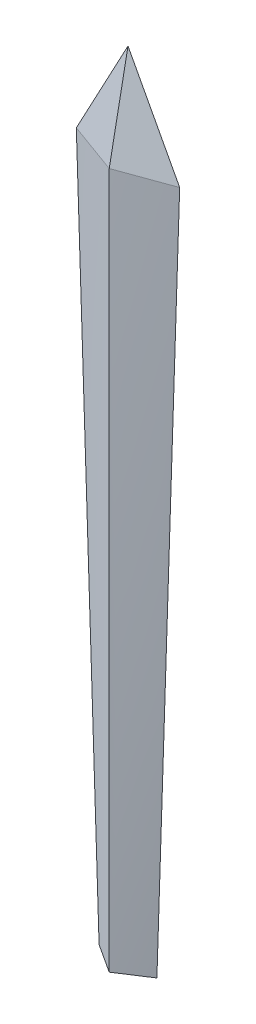
ISO-10303-21;
HEADER;
FILE_DESCRIPTION(('STEP AP214'),'2;1');
FILE_NAME('part.step','',(''),(''),'','','');
FILE_SCHEMA(('AUTOMOTIVE_DESIGN { 1 0 10303 214 1 1 1 1 }'));
ENDSEC;
DATA;
#1=APPLICATION_CONTEXT('core data for automotive mechanical design processes');
#2=APPLICATION_PROTOCOL_DEFINITION('international standard','automotive_design',2000,#1);
#3=PRODUCT_CONTEXT('',#1,'mechanical');
#4=PRODUCT('Part','Part','',(#3));
#5=PRODUCT_RELATED_PRODUCT_CATEGORY('part','',(#4));
#6=PRODUCT_DEFINITION_FORMATION('','',#4);
#7=PRODUCT_DEFINITION_CONTEXT('part definition',#1,'design');
#8=PRODUCT_DEFINITION('design','',#6,#7);
#9=PRODUCT_DEFINITION_SHAPE('','',#8);
#10=(LENGTH_UNIT() NAMED_UNIT(*) SI_UNIT(.MILLI.,.METRE.));
#11=(NAMED_UNIT(*) PLANE_ANGLE_UNIT() SI_UNIT($,.RADIAN.));
#12=(NAMED_UNIT(*) SI_UNIT($,.STERADIAN.) SOLID_ANGLE_UNIT());
#13=UNCERTAINTY_MEASURE_WITH_UNIT(LENGTH_MEASURE(1.E-05),#10,'distance_accuracy_value','');
#14=(GEOMETRIC_REPRESENTATION_CONTEXT(3) GLOBAL_UNCERTAINTY_ASSIGNED_CONTEXT((#13)) GLOBAL_UNIT_ASSIGNED_CONTEXT((#10,
#11,#12)) REPRESENTATION_CONTEXT('',''));
#15=CARTESIAN_POINT('',(0.,0.,0.));
#16=DIRECTION('',(0.,0.,1.));
#17=DIRECTION('',(1.,0.,0.));
#18=AXIS2_PLACEMENT_3D('',#15,#16,#17);
#19=CARTESIAN_POINT('',(83.1598258990977,161.257710748184,-19.05));
#20=DIRECTION('',(0.,-1.,0.));
#21=DIRECTION('',(0.,0.,-1.));
#22=AXIS2_PLACEMENT_3D('',#19,#20,#21);
#23=PLANE('',#22);
#24=CARTESIAN_POINT('',(112.49357951859,161.257710748184,0.));
#25=DIRECTION('',(0.,-1.,0.));
#26=DIRECTION('',(0.,0.,-1.));
#27=AXIS2_PLACEMENT_3D('',#24,#25,#26);
#28=CIRCLE('',#27,4.7625);
#29=CARTESIAN_POINT('',(112.49357951859,161.257710748184,-4.7625));
#30=VERTEX_POINT('',#29);
#31=EDGE_CURVE('E468',#30,#30,#28,.T.);
#32=ORIENTED_EDGE('',*,*,#31,.F.);
#33=EDGE_LOOP('',(#32));
#34=FACE_BOUND('',#33,.T.);
#35=DIRECTION('',(0.838664852319049,0.,0.544647836206726));
#36=VECTOR('',#35,1.);
#37=CARTESIAN_POINT('',(112.49357951859,161.257710748184,-19.05));
#38=LINE('',#37,#36);
#39=CARTESIAN_POINT('',(112.49357951859,161.257710748184,-19.05));
#40=VERTEX_POINT('',#39);
#41=CARTESIAN_POINT('',(141.827333138083,161.257710748184,0.));
#42=VERTEX_POINT('',#41);
#43=EDGE_CURVE('E283',#40,#42,#38,.T.);
#44=ORIENTED_EDGE('',*,*,#43,.T.);
#45=DIRECTION('',(0.838664852319049,0.,-0.544647836206726));
#46=VECTOR('',#45,1.);
#47=CARTESIAN_POINT('',(112.49357951859,161.257710748184,19.05));
#48=LINE('',#47,#46);
#49=CARTESIAN_POINT('',(112.49357951859,161.257710748184,19.05));
#50=VERTEX_POINT('',#49);
#51=EDGE_CURVE('E452',#50,#42,#48,.T.);
#52=ORIENTED_EDGE('',*,*,#51,.F.);
#53=DIRECTION('',(0.838664852319049,0.,0.544647836206726));
#54=VECTOR('',#53,1.);
#55=CARTESIAN_POINT('',(83.1598258990977,161.257710748184,0.));
#56=LINE('',#55,#54);
#57=CARTESIAN_POINT('',(83.1598258990977,161.257710748184,0.));
#58=VERTEX_POINT('',#57);
#59=EDGE_CURVE('E378',#58,#50,#56,.T.);
#60=ORIENTED_EDGE('',*,*,#59,.F.);
#61=DIRECTION('',(0.838664852319049,0.,-0.544647836206726));
#62=VECTOR('',#61,1.);
#63=CARTESIAN_POINT('',(83.1598258990977,161.257710748184,0.));
#64=LINE('',#63,#62);
#65=EDGE_CURVE('E235',#58,#40,#64,.T.);
#66=ORIENTED_EDGE('',*,*,#65,.T.);
#67=EDGE_LOOP('',(#44,#52,#60,#66));
#68=FACE_BOUND('',#67,.T.);
#69=ADVANCED_FACE('F217',(#34,#68),#23,.T.);
#70=CARTESIAN_POINT('',(141.827333138083,161.257710748184,0.));
#71=CARTESIAN_POINT('',(149.526305827459,396.68402157142,0.));
#72=CARTESIAN_POINT('',(157.225278516836,632.110332394656,0.));
#73=CARTESIAN_POINT('',(164.924251206212,867.536643217892,0.));
#74=CARTESIAN_POINT('',(139.382853669792,161.257710748184,1.58749999999999));
#75=CARTESIAN_POINT('',(146.44024530172,396.68402157142,1.58749999999999));
#76=CARTESIAN_POINT('',(153.497636933649,632.110332394656,1.58749999999999));
#77=CARTESIAN_POINT('',(160.555028565577,867.536643217892,1.58749999999999));
#78=CARTESIAN_POINT('',(134.49389473321,161.257710748184,4.76249999999998));
#79=CARTESIAN_POINT('',(140.268124250242,396.68402157142,4.76249999999998));
#80=CARTESIAN_POINT('',(146.042353767274,632.110332394655,4.76249999999998));
#81=CARTESIAN_POINT('',(151.816583284307,867.536643217891,4.76249999999998));
#82=CARTESIAN_POINT('',(127.160456328337,161.257710748184,9.52500000000001));
#83=CARTESIAN_POINT('',(131.009942673025,396.68402157142,9.52500000000001));
#84=CARTESIAN_POINT('',(134.859429017713,632.110332394657,9.52500000000001));
#85=CARTESIAN_POINT('',(138.708915362401,867.536643217893,9.52500000000001));
#86=CARTESIAN_POINT('',(119.827017923463,161.257710748184,14.2875));
#87=CARTESIAN_POINT('',(121.751761095808,396.68402157142,14.2875));
#88=CARTESIAN_POINT('',(123.676504268152,632.110332394655,14.2875));
#89=CARTESIAN_POINT('',(125.601247440496,867.536643217891,14.2875));
#90=CARTESIAN_POINT('',(114.938058986881,161.257710748184,17.4625));
#91=CARTESIAN_POINT('',(115.579640044329,396.68402157142,17.4625));
#92=CARTESIAN_POINT('',(116.221221101777,632.110332394656,17.4625));
#93=CARTESIAN_POINT('',(116.862802159226,867.536643217892,17.4625));
#94=CARTESIAN_POINT('',(112.49357951859,161.257710748184,19.05));
#95=CARTESIAN_POINT('',(112.49357951859,396.68402157142,19.05));
#96=CARTESIAN_POINT('',(112.49357951859,632.110332394656,19.05));
#97=CARTESIAN_POINT('',(112.49357951859,867.536643217892,19.05));
#98=B_SPLINE_SURFACE_WITH_KNOTS('',3,3,((#70,#71,#72,#73),(#74,#75,#76,#77),(#78,#79,#80,#81),
(#82,#83,#84,#85),(#86,#87,#88,#89),(#90,#91,#92,#93),(#94,#95,#96,#97)),.UNSPECIFIED.,.F.,.F.,
.F.,(4,1,1,1,4),(4,4),(0.861351910749801,0.89601393306235,0.9306759553749,0.96533797768745,1.),
(0.,1.),.UNSPECIFIED.);
#99=CARTESIAN_POINT('',(141.827333138083,161.257710748184,0.));
#100=CARTESIAN_POINT('',(149.526305827459,396.68402157142,0.));
#101=CARTESIAN_POINT('',(157.225278516836,632.110332394656,0.));
#102=CARTESIAN_POINT('',(164.924251206212,867.536643217892,0.));
#103=B_SPLINE_CURVE_WITH_KNOTS('',3,(#99,#100,#101,#102),.UNSPECIFIED.,.F.,.F.,(4,4),(0.,1.),.UNSPECIFIED.);
#104=CARTESIAN_POINT('',(164.924251206212,867.536643217892,0.));
#105=VERTEX_POINT('',#104);
#106=EDGE_CURVE('E366',#42,#105,#103,.T.);
#107=DIRECTION('',(-0.939883773707444,0.,0.341494497644477));
#108=VECTOR('',#107,1.);
#109=CARTESIAN_POINT('',(112.49357951859,867.536643217892,19.05));
#110=LINE('',#109,#108);
#111=CARTESIAN_POINT('',(112.49357951859,867.536643217892,19.05));
#112=VERTEX_POINT('',#111);
#113=EDGE_CURVE('E353',#105,#112,#110,.T.);
#114=CARTESIAN_POINT('',(112.49357951859,161.257710748184,19.05));
#115=CARTESIAN_POINT('',(112.49357951859,396.68402157142,19.05));
#116=CARTESIAN_POINT('',(112.49357951859,632.110332394656,19.05));
#117=CARTESIAN_POINT('',(112.49357951859,867.536643217892,19.05));
#118=B_SPLINE_CURVE_WITH_KNOTS('',3,(#114,#115,#116,#117),.UNSPECIFIED.,.F.,.F.,(4,4),(0.,1.),.UNSPECIFIED.);
#119=EDGE_CURVE('E368',#50,#112,#118,.T.);
#120=ORIENTED_EDGE('',*,*,#51,.T.);
#121=ORIENTED_EDGE('',*,*,#106,.T.);
#122=ORIENTED_EDGE('',*,*,#113,.T.);
#123=ORIENTED_EDGE('',*,*,#119,.F.);
#124=EDGE_LOOP('',(#120,#121,#122,#123));
#125=FACE_BOUND('',#124,.T.);
#126=ADVANCED_FACE('F401',(#125),#98,.F.);
#127=CARTESIAN_POINT('',(112.49357951859,161.257710748184,19.05));
#128=CARTESIAN_POINT('',(112.49357951859,396.68402157142,19.05));
#129=CARTESIAN_POINT('',(112.49357951859,632.110332394656,19.05));
#130=CARTESIAN_POINT('',(112.49357951859,867.536643217892,19.05));
#131=CARTESIAN_POINT('',(110.049100050299,161.257710748184,17.4625));
#132=CARTESIAN_POINT('',(109.407518992851,396.68402157142,17.4625));
#133=CARTESIAN_POINT('',(108.765937935403,632.110332394656,17.4625));
#134=CARTESIAN_POINT('',(108.124356877955,867.536643217892,17.4625));
#135=CARTESIAN_POINT('',(105.160141113717,161.257710748184,14.2875));
#136=CARTESIAN_POINT('',(103.235397941373,396.68402157142,14.2875));
#137=CARTESIAN_POINT('',(101.310654769029,632.110332394657,14.2875));
#138=CARTESIAN_POINT('',(99.3859115966851,867.536643217893,14.2875));
#139=CARTESIAN_POINT('',(97.826702708844,161.257710748184,9.52500000000001));
#140=CARTESIAN_POINT('',(93.9772163641559,396.68402157142,9.52500000000002));
#141=CARTESIAN_POINT('',(90.1277300194678,632.110332394655,9.52500000000002));
#142=CARTESIAN_POINT('',(86.2782436747797,867.536643217891,9.52500000000002));
#143=CARTESIAN_POINT('',(90.4932643039709,161.257710748184,4.76249999999999));
#144=CARTESIAN_POINT('',(84.7190347869387,396.68402157142,4.76249999999998));
#145=CARTESIAN_POINT('',(78.9448052699065,632.110332394656,4.76249999999998));
#146=CARTESIAN_POINT('',(73.1705757528742,867.536643217892,4.76249999999998));
#147=CARTESIAN_POINT('',(85.6043053673888,161.257710748184,1.58749999999999));
#148=CARTESIAN_POINT('',(78.5469137354605,396.68402157142,1.58749999999999));
#149=CARTESIAN_POINT('',(71.4895221035323,632.110332394656,1.58749999999999));
#150=CARTESIAN_POINT('',(64.432130471604,867.536643217892,1.58749999999999));
#151=CARTESIAN_POINT('',(83.1598258990977,161.257710748184,0.));
#152=CARTESIAN_POINT('',(75.4608532097214,396.68402157142,0.));
#153=CARTESIAN_POINT('',(67.7618805203452,632.110332394656,0.));
#154=CARTESIAN_POINT('',(60.0629078309689,867.536643217892,0.));
#155=B_SPLINE_SURFACE_WITH_KNOTS('',3,3,((#127,#128,#129,#130),(#131,#132,#133,#134),(#135,#136,
#137,#138),(#139,#140,#141,#142),(#143,#144,#145,#146),(#147,#148,#149,#150),(#151,#152,#153,
#154)),.UNSPECIFIED.,.F.,.F.,.F.,(4,1,1,1,4),(4,4),(0.,0.0346620223125498,0.0693240446250997,
0.103986066937649,0.138648089250199),(0.,1.),.UNSPECIFIED.);
#156=DIRECTION('',(-0.939883773707444,0.,-0.341494497644477));
#157=VECTOR('',#156,1.);
#158=CARTESIAN_POINT('',(60.0629078309689,867.536643217892,0.));
#159=LINE('',#158,#157);
#160=CARTESIAN_POINT('',(60.0629078309689,867.536643217891,0.));
#161=VERTEX_POINT('',#160);
#162=EDGE_CURVE('E220',#112,#161,#159,.T.);
#163=CARTESIAN_POINT('',(83.1598258990977,161.257710748184,0.));
#164=CARTESIAN_POINT('',(75.4608532097214,396.68402157142,0.));
#165=CARTESIAN_POINT('',(67.7618805203452,632.110332394656,0.));
#166=CARTESIAN_POINT('',(60.0629078309689,867.536643217892,0.));
#167=B_SPLINE_CURVE_WITH_KNOTS('',3,(#163,#164,#165,#166),.UNSPECIFIED.,.F.,.F.,(4,4),(0.,1.),.UNSPECIFIED.);
#168=EDGE_CURVE('E287',#58,#161,#167,.T.);
#169=ORIENTED_EDGE('',*,*,#59,.T.);
#170=ORIENTED_EDGE('',*,*,#119,.T.);
#171=ORIENTED_EDGE('',*,*,#162,.T.);
#172=ORIENTED_EDGE('',*,*,#168,.F.);
#173=EDGE_LOOP('',(#169,#170,#171,#172));
#174=FACE_BOUND('',#173,.T.);
#175=ADVANCED_FACE('F411',(#174),#155,.F.);
#176=CARTESIAN_POINT('',(70.9371523987199,37.9094009639735,195.237929022155));
#177=DIRECTION('',(-0.335945923324431,-0.179532280037618,-0.924612619979952));
#178=DIRECTION('',(-0.939883773707444,0.,0.341494497644477));
#179=AXIS2_PLACEMENT_3D('',#176,#177,#178);
#180=PLANE('',#179);
#181=DIRECTION('',(0.471326172585912,-0.88195897809111,0.));
#182=VECTOR('',#181,1.);
#183=CARTESIAN_POINT('',(112.49357951859,965.646411594517,0.));
#184=LINE('',#183,#182);
#185=CARTESIAN_POINT('',(112.49357951859,965.646411594518,0.));
#186=VERTEX_POINT('',#185);
#187=EDGE_CURVE('E272',#186,#105,#184,.T.);
#188=ORIENTED_EDGE('',*,*,#187,.F.);
#189=DIRECTION('',(0.,-0.981665783480344,0.190610308073625));
#190=VECTOR('',#189,1.);
#191=CARTESIAN_POINT('',(112.493579518591,35.0841450231016,180.687524509629));
#192=LINE('',#191,#190);
#193=EDGE_CURVE('E227',#186,#112,#192,.T.);
#194=ORIENTED_EDGE('',*,*,#193,.T.);
#195=ORIENTED_EDGE('',*,*,#113,.F.);
#196=EDGE_LOOP('',(#188,#194,#195));
#197=FACE_BOUND('',#196,.T.);
#198=ADVANCED_FACE('F331',(#197),#180,.F.);
#199=CARTESIAN_POINT('',(-45.5451773608428,24.3397194863806,125.352453604243));
#200=DIRECTION('',(0.335945923324431,-0.179532280037617,-0.924612619979952));
#201=DIRECTION('',(-0.939883773707444,0.,-0.341494497644477));
#202=AXIS2_PLACEMENT_3D('',#199,#200,#201);
#203=PLANE('',#202);
#204=DIRECTION('',(-0.471326172585912,-0.88195897809111,0.));
#205=VECTOR('',#204,1.);
#206=CARTESIAN_POINT('',(112.49357951859,965.646411594517,0.));
#207=LINE('',#206,#205);
#208=EDGE_CURVE('E263',#186,#161,#207,.T.);
#209=ORIENTED_EDGE('',*,*,#208,.T.);
#210=ORIENTED_EDGE('',*,*,#162,.F.);
#211=ORIENTED_EDGE('',*,*,#193,.F.);
#212=EDGE_LOOP('',(#209,#210,#211));
#213=FACE_BOUND('',#212,.T.);
#214=ADVANCED_FACE('F322',(#213),#203,.F.);
#215=CARTESIAN_POINT('',(141.827333138083,161.257710748184,0.));
#216=CARTESIAN_POINT('',(149.526305827459,396.68402157142,0.));
#217=CARTESIAN_POINT('',(157.225278516836,632.110332394656,0.));
#218=CARTESIAN_POINT('',(164.924251206212,867.536643217892,0.));
#219=CARTESIAN_POINT('',(139.382853669792,161.257710748184,-1.58749999999999));
#220=CARTESIAN_POINT('',(146.44024530172,396.68402157142,-1.58749999999999));
#221=CARTESIAN_POINT('',(153.497636933649,632.110332394656,-1.58749999999999));
#222=CARTESIAN_POINT('',(160.555028565577,867.536643217892,-1.58749999999999));
#223=CARTESIAN_POINT('',(134.49389473321,161.257710748184,-4.76249999999998));
#224=CARTESIAN_POINT('',(140.268124250242,396.68402157142,-4.76249999999998));
#225=CARTESIAN_POINT('',(146.042353767274,632.110332394655,-4.76249999999998));
#226=CARTESIAN_POINT('',(151.816583284307,867.536643217891,-4.76249999999998));
#227=CARTESIAN_POINT('',(127.160456328337,161.257710748184,-9.52500000000001));
#228=CARTESIAN_POINT('',(131.009942673025,396.68402157142,-9.52500000000001));
#229=CARTESIAN_POINT('',(134.859429017713,632.110332394657,-9.52500000000001));
#230=CARTESIAN_POINT('',(138.708915362401,867.536643217893,-9.52500000000001));
#231=CARTESIAN_POINT('',(119.827017923463,161.257710748184,-14.2875));
#232=CARTESIAN_POINT('',(121.751761095808,396.68402157142,-14.2875));
#233=CARTESIAN_POINT('',(123.676504268152,632.110332394655,-14.2875));
#234=CARTESIAN_POINT('',(125.601247440496,867.536643217891,-14.2875));
#235=CARTESIAN_POINT('',(114.938058986881,161.257710748184,-17.4625));
#236=CARTESIAN_POINT('',(115.579640044329,396.68402157142,-17.4625));
#237=CARTESIAN_POINT('',(116.221221101777,632.110332394656,-17.4625));
#238=CARTESIAN_POINT('',(116.862802159226,867.536643217892,-17.4625));
#239=CARTESIAN_POINT('',(112.49357951859,161.257710748184,-19.05));
#240=CARTESIAN_POINT('',(112.49357951859,396.68402157142,-19.05));
#241=CARTESIAN_POINT('',(112.49357951859,632.110332394656,-19.05));
#242=CARTESIAN_POINT('',(112.49357951859,867.536643217892,-19.05));
#243=B_SPLINE_SURFACE_WITH_KNOTS('',3,3,((#215,#216,#217,#218),(#219,#220,#221,#222),(#223,#224,
#225,#226),(#227,#228,#229,#230),(#231,#232,#233,#234),(#235,#236,#237,#238),(#239,#240,#241,
#242)),.UNSPECIFIED.,.F.,.F.,.F.,(4,1,1,1,4),(4,4),(0.861351910749801,0.89601393306235,
0.9306759553749,0.96533797768745,1.),(0.,1.),.UNSPECIFIED.);
#244=CARTESIAN_POINT('',(112.49357951859,161.257710748184,-19.05));
#245=CARTESIAN_POINT('',(112.49357951859,396.68402157142,-19.05));
#246=CARTESIAN_POINT('',(112.49357951859,632.110332394656,-19.05));
#247=CARTESIAN_POINT('',(112.49357951859,867.536643217892,-19.05));
#248=B_SPLINE_CURVE_WITH_KNOTS('',3,(#244,#245,#246,#247),.UNSPECIFIED.,.F.,.F.,(4,4),(0.,1.),.UNSPECIFIED.);
#249=CARTESIAN_POINT('',(112.49357951859,867.536643217892,-19.05));
#250=VERTEX_POINT('',#249);
#251=EDGE_CURVE('E276',#40,#250,#248,.T.);
#252=DIRECTION('',(-0.939883773707444,0.,-0.341494497644477));
#253=VECTOR('',#252,1.);
#254=CARTESIAN_POINT('',(112.49357951859,867.536643217892,-19.05));
#255=LINE('',#254,#253);
#256=EDGE_CURVE('E267',#105,#250,#255,.T.);
#257=ORIENTED_EDGE('',*,*,#43,.F.);
#258=ORIENTED_EDGE('',*,*,#251,.T.);
#259=ORIENTED_EDGE('',*,*,#256,.F.);
#260=ORIENTED_EDGE('',*,*,#106,.F.);
#261=EDGE_LOOP('',(#257,#258,#259,#260));
#262=FACE_BOUND('',#261,.T.);
#263=ADVANCED_FACE('F281',(#262),#243,.T.);
#264=CARTESIAN_POINT('',(112.49357951859,161.257710748184,-19.05));
#265=CARTESIAN_POINT('',(112.49357951859,396.68402157142,-19.05));
#266=CARTESIAN_POINT('',(112.49357951859,632.110332394656,-19.05));
#267=CARTESIAN_POINT('',(112.49357951859,867.536643217892,-19.05));
#268=CARTESIAN_POINT('',(110.049100050299,161.257710748184,-17.4625));
#269=CARTESIAN_POINT('',(109.407518992851,396.68402157142,-17.4625));
#270=CARTESIAN_POINT('',(108.765937935403,632.110332394656,-17.4625));
#271=CARTESIAN_POINT('',(108.124356877955,867.536643217892,-17.4625));
#272=CARTESIAN_POINT('',(105.160141113717,161.257710748184,-14.2875));
#273=CARTESIAN_POINT('',(103.235397941373,396.68402157142,-14.2875));
#274=CARTESIAN_POINT('',(101.310654769029,632.110332394657,-14.2875));
#275=CARTESIAN_POINT('',(99.3859115966851,867.536643217893,-14.2875));
#276=CARTESIAN_POINT('',(97.826702708844,161.257710748184,-9.52500000000001));
#277=CARTESIAN_POINT('',(93.9772163641559,396.68402157142,-9.52500000000002));
#278=CARTESIAN_POINT('',(90.1277300194678,632.110332394655,-9.52500000000002));
#279=CARTESIAN_POINT('',(86.2782436747797,867.536643217891,-9.52500000000002));
#280=CARTESIAN_POINT('',(90.4932643039709,161.257710748184,-4.76249999999999));
#281=CARTESIAN_POINT('',(84.7190347869387,396.68402157142,-4.76249999999998));
#282=CARTESIAN_POINT('',(78.9448052699065,632.110332394656,-4.76249999999998));
#283=CARTESIAN_POINT('',(73.1705757528742,867.536643217892,-4.76249999999998));
#284=CARTESIAN_POINT('',(85.6043053673888,161.257710748184,-1.58749999999999));
#285=CARTESIAN_POINT('',(78.5469137354605,396.68402157142,-1.58749999999999));
#286=CARTESIAN_POINT('',(71.4895221035323,632.110332394656,-1.58749999999999));
#287=CARTESIAN_POINT('',(64.432130471604,867.536643217892,-1.58749999999999));
#288=CARTESIAN_POINT('',(83.1598258990977,161.257710748184,0.));
#289=CARTESIAN_POINT('',(75.4608532097214,396.68402157142,0.));
#290=CARTESIAN_POINT('',(67.7618805203452,632.110332394656,0.));
#291=CARTESIAN_POINT('',(60.0629078309689,867.536643217892,0.));
#292=B_SPLINE_SURFACE_WITH_KNOTS('',3,3,((#264,#265,#266,#267),(#268,#269,#270,#271),(#272,#273,
#274,#275),(#276,#277,#278,#279),(#280,#281,#282,#283),(#284,#285,#286,#287),(#288,#289,#290,
#291)),.UNSPECIFIED.,.F.,.F.,.F.,(4,1,1,1,4),(4,4),(0.,0.0346620223125498,0.0693240446250997,
0.103986066937649,0.138648089250199),(0.,1.),.UNSPECIFIED.);
#293=DIRECTION('',(-0.939883773707444,0.,0.341494497644477));
#294=VECTOR('',#293,1.);
#295=CARTESIAN_POINT('',(60.0629078309689,867.536643217892,0.));
#296=LINE('',#295,#294);
#297=EDGE_CURVE('E260',#250,#161,#296,.T.);
#298=ORIENTED_EDGE('',*,*,#65,.F.);
#299=ORIENTED_EDGE('',*,*,#168,.T.);
#300=ORIENTED_EDGE('',*,*,#297,.F.);
#301=ORIENTED_EDGE('',*,*,#251,.F.);
#302=EDGE_LOOP('',(#298,#299,#300,#301));
#303=FACE_BOUND('',#302,.T.);
#304=ADVANCED_FACE('F286',(#303),#292,.T.);
#305=CARTESIAN_POINT('',(70.9371523987199,37.9094009639735,-195.237929022155));
#306=DIRECTION('',(-0.335945923324431,-0.179532280037618,0.924612619979952));
#307=DIRECTION('',(-0.939883773707444,0.,-0.341494497644477));
#308=AXIS2_PLACEMENT_3D('',#305,#306,#307);
#309=PLANE('',#308);
#310=ORIENTED_EDGE('',*,*,#256,.T.);
#311=DIRECTION('',(0.,0.981665783480344,0.190610308073625));
#312=VECTOR('',#311,1.);
#313=CARTESIAN_POINT('',(112.493579518591,35.0841450231016,-180.687524509629));
#314=LINE('',#313,#312);
#315=EDGE_CURVE('E13',#250,#186,#314,.T.);
#316=ORIENTED_EDGE('',*,*,#315,.T.);
#317=ORIENTED_EDGE('',*,*,#187,.T.);
#318=EDGE_LOOP('',(#310,#316,#317));
#319=FACE_BOUND('',#318,.T.);
#320=ADVANCED_FACE('F270',(#319),#309,.F.);
#321=CARTESIAN_POINT('',(-45.5451773608428,24.3397194863806,-125.352453604243));
#322=DIRECTION('',(0.335945923324431,-0.179532280037617,0.924612619979952));
#323=DIRECTION('',(-0.939883773707444,0.,0.341494497644477));
#324=AXIS2_PLACEMENT_3D('',#321,#322,#323);
#325=PLANE('',#324);
#326=ORIENTED_EDGE('',*,*,#315,.F.);
#327=ORIENTED_EDGE('',*,*,#297,.T.);
#328=ORIENTED_EDGE('',*,*,#208,.F.);
#329=EDGE_LOOP('',(#326,#327,#328));
#330=FACE_BOUND('',#329,.T.);
#331=ADVANCED_FACE('F258',(#330),#325,.F.);
#332=CARTESIAN_POINT('',(112.49357951859,770.857710748184,0.));
#333=DIRECTION('',(0.,-1.,0.));
#334=DIRECTION('',(0.,0.,-1.));
#335=AXIS2_PLACEMENT_3D('',#332,#333,#334);
#336=CYLINDRICAL_SURFACE('',#335,4.7625);
#337=CARTESIAN_POINT('',(112.49357951859,770.857710748184,0.));
#338=DIRECTION('',(0.,-1.,0.));
#339=DIRECTION('',(0.,0.,-1.));
#340=AXIS2_PLACEMENT_3D('',#337,#338,#339);
#341=CIRCLE('',#340,4.7625);
#342=CARTESIAN_POINT('',(112.49357951859,770.857710748184,-4.7625));
#343=VERTEX_POINT('',#342);
#344=EDGE_CURVE('E288',#343,#343,#341,.T.);
#345=CARTESIAN_POINT('',(112.49357951859,770.857710748184,-4.7625));
#346=CARTESIAN_POINT('',(112.49357951859,764.507710748184,-4.7625));
#347=CARTESIAN_POINT('',(112.49357951859,758.157710748184,-4.7625));
#348=CARTESIAN_POINT('',(112.49357951859,745.457710748184,-4.7625));
#349=CARTESIAN_POINT('',(112.49357951859,739.107710748184,-4.7625));
#350=CARTESIAN_POINT('',(112.49357951859,726.407710748184,-4.7625));
#351=CARTESIAN_POINT('',(112.49357951859,720.057710748184,-4.7625));
#352=CARTESIAN_POINT('',(112.49357951859,707.357710748184,-4.7625));
#353=CARTESIAN_POINT('',(112.49357951859,701.007710748184,-4.7625));
#354=CARTESIAN_POINT('',(112.49357951859,688.307710748184,-4.7625));
#355=CARTESIAN_POINT('',(112.49357951859,681.957710748184,-4.7625));
#356=CARTESIAN_POINT('',(112.49357951859,669.257710748184,-4.7625));
#357=CARTESIAN_POINT('',(112.49357951859,662.907710748184,-4.7625));
#358=CARTESIAN_POINT('',(112.49357951859,650.207710748184,-4.7625));
#359=CARTESIAN_POINT('',(112.49357951859,643.857710748184,-4.7625));
#360=CARTESIAN_POINT('',(112.49357951859,631.157710748184,-4.7625));
#361=CARTESIAN_POINT('',(112.49357951859,624.807710748184,-4.7625));
#362=CARTESIAN_POINT('',(112.49357951859,612.107710748184,-4.7625));
#363=CARTESIAN_POINT('',(112.49357951859,605.757710748184,-4.7625));
#364=CARTESIAN_POINT('',(112.49357951859,593.057710748184,-4.7625));
#365=CARTESIAN_POINT('',(112.49357951859,586.707710748184,-4.7625));
#366=CARTESIAN_POINT('',(112.49357951859,574.007710748184,-4.7625));
#367=CARTESIAN_POINT('',(112.49357951859,567.657710748184,-4.7625));
#368=CARTESIAN_POINT('',(112.49357951859,554.957710748184,-4.7625));
#369=CARTESIAN_POINT('',(112.49357951859,548.607710748184,-4.7625));
#370=CARTESIAN_POINT('',(112.49357951859,535.907710748184,-4.7625));
#371=CARTESIAN_POINT('',(112.49357951859,529.557710748184,-4.7625));
#372=CARTESIAN_POINT('',(112.49357951859,516.857710748184,-4.7625));
#373=CARTESIAN_POINT('',(112.49357951859,510.507710748184,-4.7625));
#374=CARTESIAN_POINT('',(112.49357951859,497.807710748184,-4.7625));
#375=CARTESIAN_POINT('',(112.49357951859,491.457710748184,-4.7625));
#376=CARTESIAN_POINT('',(112.49357951859,478.757710748184,-4.7625));
#377=CARTESIAN_POINT('',(112.49357951859,472.407710748184,-4.7625));
#378=CARTESIAN_POINT('',(112.49357951859,459.707710748184,-4.7625));
#379=CARTESIAN_POINT('',(112.49357951859,453.357710748184,-4.7625));
#380=CARTESIAN_POINT('',(112.49357951859,440.657710748184,-4.7625));
#381=CARTESIAN_POINT('',(112.49357951859,434.307710748184,-4.7625));
#382=CARTESIAN_POINT('',(112.49357951859,421.607710748184,-4.7625));
#383=CARTESIAN_POINT('',(112.49357951859,415.257710748184,-4.7625));
#384=CARTESIAN_POINT('',(112.49357951859,402.557710748184,-4.7625));
#385=CARTESIAN_POINT('',(112.49357951859,396.207710748184,-4.7625));
#386=CARTESIAN_POINT('',(112.49357951859,383.507710748184,-4.7625));
#387=CARTESIAN_POINT('',(112.49357951859,377.157710748184,-4.7625));
#388=CARTESIAN_POINT('',(112.49357951859,364.457710748184,-4.7625));
#389=CARTESIAN_POINT('',(112.49357951859,358.107710748184,-4.7625));
#390=CARTESIAN_POINT('',(112.49357951859,345.407710748184,-4.7625));
#391=CARTESIAN_POINT('',(112.49357951859,339.057710748184,-4.7625));
#392=CARTESIAN_POINT('',(112.49357951859,326.357710748184,-4.7625));
#393=CARTESIAN_POINT('',(112.49357951859,320.007710748184,-4.7625));
#394=CARTESIAN_POINT('',(112.49357951859,307.307710748184,-4.7625));
#395=CARTESIAN_POINT('',(112.49357951859,300.957710748184,-4.7625));
#396=CARTESIAN_POINT('',(112.49357951859,288.257710748184,-4.7625));
#397=CARTESIAN_POINT('',(112.49357951859,281.907710748184,-4.7625));
#398=CARTESIAN_POINT('',(112.49357951859,269.207710748184,-4.7625));
#399=CARTESIAN_POINT('',(112.49357951859,262.857710748184,-4.7625));
#400=CARTESIAN_POINT('',(112.49357951859,250.157710748184,-4.7625));
#401=CARTESIAN_POINT('',(112.49357951859,243.807710748184,-4.7625));
#402=CARTESIAN_POINT('',(112.49357951859,231.107710748184,-4.7625));
#403=CARTESIAN_POINT('',(112.49357951859,224.757710748184,-4.7625));
#404=CARTESIAN_POINT('',(112.49357951859,212.057710748184,-4.7625));
#405=CARTESIAN_POINT('',(112.49357951859,205.707710748184,-4.7625));
#406=CARTESIAN_POINT('',(112.49357951859,193.007710748184,-4.7625));
#407=CARTESIAN_POINT('',(112.49357951859,186.657710748184,-4.7625));
#408=CARTESIAN_POINT('',(112.49357951859,173.957710748184,-4.7625));
#409=CARTESIAN_POINT('',(112.49357951859,167.607710748184,-4.7625));
#410=CARTESIAN_POINT('',(112.49357951859,161.257710748184,-4.7625));
#411=B_SPLINE_CURVE_WITH_KNOTS('',3,(#345,#346,#347,#348,#349,#350,#351,#352,#353,#354,#355,
#356,#357,#358,#359,#360,#361,#362,#363,#364,#365,#366,#367,#368,#369,#370,#371,#372,#373,#374,
#375,#376,#377,#378,#379,#380,#381,#382,#383,#384,#385,#386,#387,#388,#389,#390,#391,#392,#393,
#394,#395,#396,#397,#398,#399,#400,#401,#402,#403,#404,#405,#406,#407,#408,#409,#410),
.UNSPECIFIED.,.F.,.F.,(4,2,2,2,2,2,2,2,2,2,2,2,2,2,2,2,2,2,2,2,2,2,2,2,2,2,2,2,2,2,2,2,4),(0.,
19.0499999999999,38.0999999999999,57.1499999999999,76.1999999999999,95.2499999999999,114.3,
133.35,152.4,171.45,190.5,209.55,228.6,247.65,266.7,285.75,304.8,323.85,342.9,361.95,381.,
400.05,419.1,438.15,457.2,476.25,495.3,514.35,533.4,552.45,571.5,590.55,609.6),.UNSPECIFIED.);
#412=EDGE_CURVE('BSEAM483',#343,#30,#411,.T.);
#413=ORIENTED_EDGE('',*,*,#344,.F.);
#414=ORIENTED_EDGE('',*,*,#31,.T.);
#415=ORIENTED_EDGE('',*,*,#412,.T.);
#416=ORIENTED_EDGE('',*,*,#412,.F.);
#417=EDGE_LOOP('',(#413,#415,#414,#416));
#418=FACE_BOUND('',#417,.T.);
#419=ADVANCED_FACE('F483',(#418),#336,.F.);
#420=CARTESIAN_POINT('',(112.49357951859,770.857710748184,0.));
#421=DIRECTION('',(0.,-1.,0.));
#422=DIRECTION('',(0.,0.,-1.));
#423=AXIS2_PLACEMENT_3D('',#420,#421,#422);
#424=PLANE('',#423);
#425=ORIENTED_EDGE('',*,*,#344,.T.);
#426=EDGE_LOOP('',(#425));
#427=FACE_BOUND('',#426,.T.);
#428=ADVANCED_FACE('F486',(#427),#424,.T.);
#429=CLOSED_SHELL('',(#69,#126,#175,#198,#214,#263,#304,#320,#331,#419,#428));
#430=MANIFOLD_SOLID_BREP('B2',#429);
#431=ADVANCED_BREP_SHAPE_REPRESENTATION('',(#18,#430),#14);
#432=SHAPE_DEFINITION_REPRESENTATION(#9,#431);
ENDSEC;
END-ISO-10303-21;
